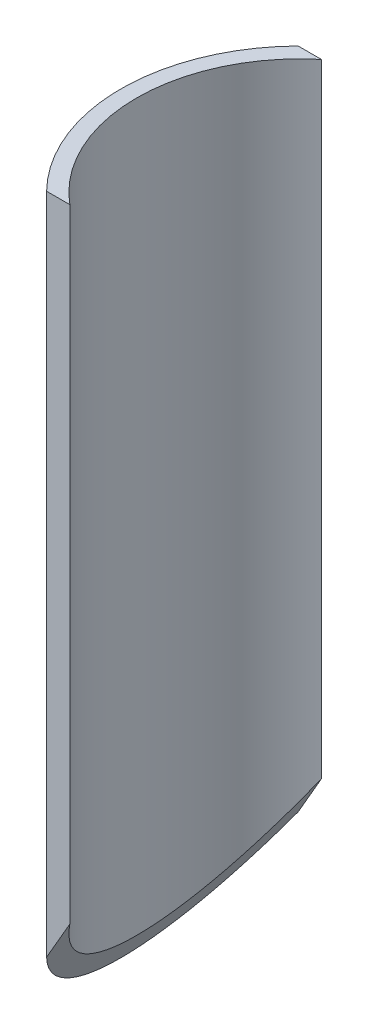
ISO-10303-21;
HEADER;
FILE_DESCRIPTION(('STEP AP214'),'2;1');
FILE_NAME('part.step','',(''),(''),'','','');
FILE_SCHEMA(('AUTOMOTIVE_DESIGN { 1 0 10303 214 1 1 1 1 }'));
ENDSEC;
DATA;
#1=APPLICATION_CONTEXT('core data for automotive mechanical design processes');
#2=APPLICATION_PROTOCOL_DEFINITION('international standard','automotive_design',2000,#1);
#3=PRODUCT_CONTEXT('',#1,'mechanical');
#4=PRODUCT('Part','Part','',(#3));
#5=PRODUCT_RELATED_PRODUCT_CATEGORY('part','',(#4));
#6=PRODUCT_DEFINITION_FORMATION('','',#4);
#7=PRODUCT_DEFINITION_CONTEXT('part definition',#1,'design');
#8=PRODUCT_DEFINITION('design','',#6,#7);
#9=PRODUCT_DEFINITION_SHAPE('','',#8);
#10=(LENGTH_UNIT() NAMED_UNIT(*) SI_UNIT(.MILLI.,.METRE.));
#11=(NAMED_UNIT(*) PLANE_ANGLE_UNIT() SI_UNIT($,.RADIAN.));
#12=(NAMED_UNIT(*) SI_UNIT($,.STERADIAN.) SOLID_ANGLE_UNIT());
#13=UNCERTAINTY_MEASURE_WITH_UNIT(LENGTH_MEASURE(1.E-05),#10,'distance_accuracy_value','');
#14=(GEOMETRIC_REPRESENTATION_CONTEXT(3) GLOBAL_UNCERTAINTY_ASSIGNED_CONTEXT((#13)) GLOBAL_UNIT_ASSIGNED_CONTEXT((#10,
#11,#12)) REPRESENTATION_CONTEXT('',''));
#15=CARTESIAN_POINT('',(0.,0.,0.));
#16=DIRECTION('',(0.,0.,1.));
#17=DIRECTION('',(1.,0.,0.));
#18=AXIS2_PLACEMENT_3D('',#15,#16,#17);
#19=CARTESIAN_POINT('',(56.9994590845153,270.,-39.9999999999997));
#20=DIRECTION('',(0.,0.,1.));
#21=DIRECTION('',(1.,0.,0.));
#22=AXIS2_PLACEMENT_3D('',#19,#20,#21);
#23=PLANE('',#22);
#24=DIRECTION('',(-1.,0.,0.));
#25=VECTOR('',#24,1.);
#26=CARTESIAN_POINT('',(56.9994590845153,270.,-39.9999999999997));
#27=LINE('',#26,#25);
#28=CARTESIAN_POINT('',(-33.226495451672,270.,-40.0000000000003));
#29=VERTEX_POINT('',#28);
#30=CARTESIAN_POINT('',(-40.6078810084936,270.,-40.0000000000003));
#31=VERTEX_POINT('',#30);
#32=EDGE_CURVE('E91',#29,#31,#27,.T.);
#33=ORIENTED_EDGE('',*,*,#32,.F.);
#34=DIRECTION('',(0.,-1.,0.));
#35=VECTOR('',#34,1.);
#36=CARTESIAN_POINT('',(-33.226495451672,270.,-40.0000000000003));
#37=LINE('',#36,#35);
#38=CARTESIAN_POINT('',(-33.226495451672,71.857851163216,-40.0000000000003));
#39=VERTEX_POINT('',#38);
#40=EDGE_CURVE('E43',#29,#39,#37,.T.);
#41=ORIENTED_EDGE('',*,*,#40,.T.);
#42=DIRECTION('',(0.500000000000001,0.866025403784438,0.));
#43=VECTOR('',#42,1.);
#44=CARTESIAN_POINT('',(89.3296736266817,284.131362787926,-39.9999999999995));
#45=LINE('',#44,#43);
#46=CARTESIAN_POINT('',(-40.6078810084936,59.0729163485459,-40.0000000000003));
#47=VERTEX_POINT('',#46);
#48=EDGE_CURVE('E105',#47,#39,#45,.T.);
#49=ORIENTED_EDGE('',*,*,#48,.F.);
#50=DIRECTION('',(0.,-1.,0.));
#51=VECTOR('',#50,1.);
#52=CARTESIAN_POINT('',(-40.6078810084936,270.,-40.0000000000003));
#53=LINE('',#52,#51);
#54=EDGE_CURVE('E56',#31,#47,#53,.T.);
#55=ORIENTED_EDGE('',*,*,#54,.F.);
#56=EDGE_LOOP('',(#33,#41,#49,#55));
#57=FACE_BOUND('',#56,.T.);
#58=ADVANCED_FACE('F39',(#57),#23,.F.);
#59=CARTESIAN_POINT('',(56.9994590845147,270.,40.0000000000003));
#60=DIRECTION('',(0.,0.,-1.));
#61=DIRECTION('',(-1.,0.,0.));
#62=AXIS2_PLACEMENT_3D('',#59,#60,#61);
#63=PLANE('',#62);
#64=DIRECTION('',(-0.500000000000001,-0.866025403784438,0.));
#65=VECTOR('',#64,1.);
#66=CARTESIAN_POINT('',(89.3296736266816,284.131362787926,40.0000000000005));
#67=LINE('',#66,#65);
#68=CARTESIAN_POINT('',(-33.2264954516727,71.8578511632147,39.9999999999997));
#69=VERTEX_POINT('',#68);
#70=CARTESIAN_POINT('',(-40.6078810084943,59.0729163485448,39.9999999999996));
#71=VERTEX_POINT('',#70);
#72=EDGE_CURVE('E106',#69,#71,#67,.T.);
#73=ORIENTED_EDGE('',*,*,#72,.F.);
#74=DIRECTION('',(0.,-1.,0.));
#75=VECTOR('',#74,1.);
#76=CARTESIAN_POINT('',(-33.2264954516727,270.,39.9999999999997));
#77=LINE('',#76,#75);
#78=CARTESIAN_POINT('',(-33.2264954516727,270.,39.9999999999997));
#79=VERTEX_POINT('',#78);
#80=EDGE_CURVE('E96',#69,#79,#77,.F.);
#81=ORIENTED_EDGE('',*,*,#80,.T.);
#82=DIRECTION('',(-1.,0.,0.));
#83=VECTOR('',#82,1.);
#84=CARTESIAN_POINT('',(-2.7931850710745E-13,270.,39.9999999999999));
#85=LINE('',#84,#83);
#86=CARTESIAN_POINT('',(-40.6078810084943,270.,39.9999999999996));
#87=VERTEX_POINT('',#86);
#88=EDGE_CURVE('E94',#79,#87,#85,.T.);
#89=ORIENTED_EDGE('',*,*,#88,.T.);
#90=DIRECTION('',(0.,-1.,0.));
#91=VECTOR('',#90,1.);
#92=CARTESIAN_POINT('',(-40.6078810084943,270.,39.9999999999996));
#93=LINE('',#92,#91);
#94=EDGE_CURVE('E83',#71,#87,#93,.F.);
#95=ORIENTED_EDGE('',*,*,#94,.F.);
#96=EDGE_LOOP('',(#73,#81,#89,#95));
#97=FACE_BOUND('',#96,.T.);
#98=ADVANCED_FACE('F95',(#97),#63,.F.);
#99=CARTESIAN_POINT('',(0.,270.,0.));
#100=DIRECTION('',(0.,1.,0.));
#101=DIRECTION('',(1.,0.,0.));
#102=AXIS2_PLACEMENT_3D('',#99,#100,#101);
#103=PLANE('',#102);
#104=CARTESIAN_POINT('',(0.,270.,0.));
#105=DIRECTION('',(0.,1.,0.));
#106=DIRECTION('',(0.,0.,1.));
#107=AXIS2_PLACEMENT_3D('',#104,#105,#106);
#108=CIRCLE('',#107,52.);
#109=EDGE_CURVE('E48',#29,#79,#108,.T.);
#110=ORIENTED_EDGE('',*,*,#109,.F.);
#111=ORIENTED_EDGE('',*,*,#32,.T.);
#112=CARTESIAN_POINT('',(0.,270.,0.));
#113=DIRECTION('',(0.,1.,0.));
#114=DIRECTION('',(1.,0.,0.));
#115=AXIS2_PLACEMENT_3D('',#112,#113,#114);
#116=CIRCLE('',#115,57.);
#117=EDGE_CURVE('E11',#31,#87,#116,.T.);
#118=ORIENTED_EDGE('',*,*,#117,.T.);
#119=ORIENTED_EDGE('',*,*,#88,.F.);
#120=EDGE_LOOP('',(#110,#111,#118,#119));
#121=FACE_BOUND('',#120,.T.);
#122=ADVANCED_FACE('F100',(#121),#103,.T.);
#123=CARTESIAN_POINT('',(89.3296736266818,284.131362787926,-57.01));
#124=DIRECTION('',(-0.866025403784438,0.500000000000001,0.));
#125=DIRECTION('',(-0.500000000000001,-0.866025403784438,0.));
#126=AXIS2_PLACEMENT_3D('',#123,#124,#125);
#127=PLANE('',#126);
#128=CARTESIAN_POINT('',(0.,129.407829442968,0.));
#129=DIRECTION('',(-0.866025403784438,0.500000000000001,0.));
#130=DIRECTION('',(-0.500000000000001,-0.866025403784438,0.));
#131=AXIS2_PLACEMENT_3D('',#128,#129,#130);
#132=ELLIPSE('',#131,114.,57.);
#133=EDGE_CURVE('E87',#47,#71,#132,.T.);
#134=ORIENTED_EDGE('',*,*,#133,.F.);
#135=ORIENTED_EDGE('',*,*,#48,.T.);
#136=CARTESIAN_POINT('',(0.,129.407829442968,0.));
#137=DIRECTION('',(-0.866025403784438,0.500000000000001,0.));
#138=DIRECTION('',(-0.500000000000001,-0.866025403784438,0.));
#139=AXIS2_PLACEMENT_3D('',#136,#137,#138);
#140=ELLIPSE('',#139,104.,52.);
#141=EDGE_CURVE('E101',#39,#69,#140,.T.);
#142=ORIENTED_EDGE('',*,*,#141,.T.);
#143=ORIENTED_EDGE('',*,*,#72,.T.);
#144=EDGE_LOOP('',(#134,#135,#142,#143));
#145=FACE_BOUND('',#144,.T.);
#146=ADVANCED_FACE('F113',(#145),#127,.F.);
#147=CARTESIAN_POINT('',(0.,270.,0.));
#148=DIRECTION('',(0.,-1.,0.));
#149=DIRECTION('',(0.,0.,-1.));
#150=AXIS2_PLACEMENT_3D('',#147,#148,#149);
#151=CYLINDRICAL_SURFACE('',#150,57.);
#152=ORIENTED_EDGE('',*,*,#117,.F.);
#153=ORIENTED_EDGE('',*,*,#54,.T.);
#154=ORIENTED_EDGE('',*,*,#133,.T.);
#155=ORIENTED_EDGE('',*,*,#94,.T.);
#156=EDGE_LOOP('',(#152,#153,#154,#155));
#157=FACE_BOUND('',#156,.T.);
#158=ADVANCED_FACE('F85',(#157),#151,.T.);
#159=CARTESIAN_POINT('',(0.,270.,0.));
#160=DIRECTION('',(0.,-1.,0.));
#161=DIRECTION('',(0.,0.,-1.));
#162=AXIS2_PLACEMENT_3D('',#159,#160,#161);
#163=CYLINDRICAL_SURFACE('',#162,52.);
#164=ORIENTED_EDGE('',*,*,#40,.F.);
#165=ORIENTED_EDGE('',*,*,#109,.T.);
#166=ORIENTED_EDGE('',*,*,#80,.F.);
#167=ORIENTED_EDGE('',*,*,#141,.F.);
#168=EDGE_LOOP('',(#164,#165,#166,#167));
#169=FACE_BOUND('',#168,.T.);
#170=ADVANCED_FACE('F41',(#169),#163,.F.);
#171=CLOSED_SHELL('',(#58,#98,#122,#146,#158,#170));
#172=MANIFOLD_SOLID_BREP('B2',#171);
#173=ADVANCED_BREP_SHAPE_REPRESENTATION('',(#18,#172),#14);
#174=SHAPE_DEFINITION_REPRESENTATION(#9,#173);
ENDSEC;
END-ISO-10303-21;
